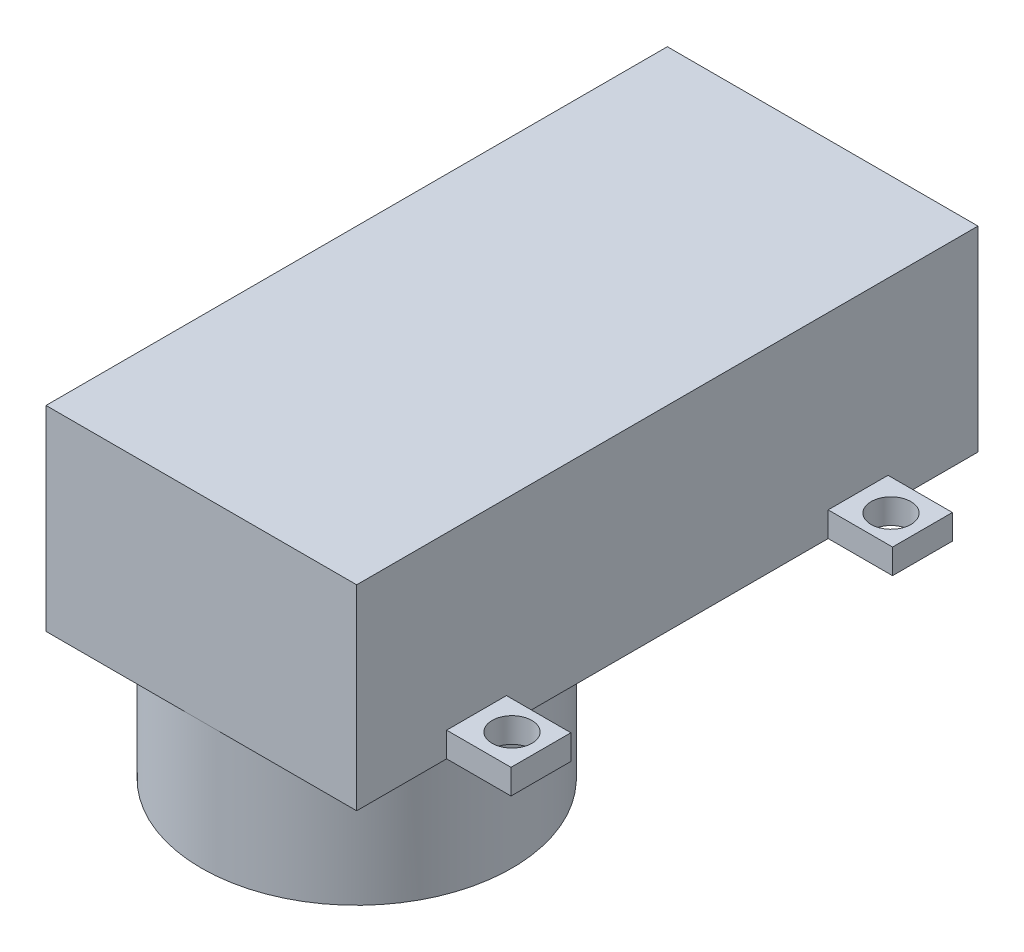
ISO-10303-21;
HEADER;
FILE_DESCRIPTION(('STEP AP214'),'2;1');
FILE_NAME('part.step','',(''),(''),'','','');
FILE_SCHEMA(('AUTOMOTIVE_DESIGN { 1 0 10303 214 1 1 1 1 }'));
ENDSEC;
DATA;
#1=APPLICATION_CONTEXT('core data for automotive mechanical design processes');
#2=APPLICATION_PROTOCOL_DEFINITION('international standard','automotive_design',2000,#1);
#3=PRODUCT_CONTEXT('',#1,'mechanical');
#4=PRODUCT('Part','Part','',(#3));
#5=PRODUCT_RELATED_PRODUCT_CATEGORY('part','',(#4));
#6=PRODUCT_DEFINITION_FORMATION('','',#4);
#7=PRODUCT_DEFINITION_CONTEXT('part definition',#1,'design');
#8=PRODUCT_DEFINITION('design','',#6,#7);
#9=PRODUCT_DEFINITION_SHAPE('','',#8);
#10=(LENGTH_UNIT() NAMED_UNIT(*) SI_UNIT(.MILLI.,.METRE.));
#11=(NAMED_UNIT(*) PLANE_ANGLE_UNIT() SI_UNIT($,.RADIAN.));
#12=(NAMED_UNIT(*) SI_UNIT($,.STERADIAN.) SOLID_ANGLE_UNIT());
#13=UNCERTAINTY_MEASURE_WITH_UNIT(LENGTH_MEASURE(1.E-05),#10,'distance_accuracy_value','');
#14=(GEOMETRIC_REPRESENTATION_CONTEXT(3) GLOBAL_UNCERTAINTY_ASSIGNED_CONTEXT((#13)) GLOBAL_UNIT_ASSIGNED_CONTEXT((#10,
#11,#12)) REPRESENTATION_CONTEXT('',''));
#15=CARTESIAN_POINT('',(0.,0.,0.));
#16=DIRECTION('',(0.,0.,1.));
#17=DIRECTION('',(1.,0.,0.));
#18=AXIS2_PLACEMENT_3D('',#15,#16,#17);
#19=CARTESIAN_POINT('',(0.,0.,0.));
#20=DIRECTION('',(0.,1.,0.));
#21=DIRECTION('',(0.,0.,1.));
#22=AXIS2_PLACEMENT_3D('',#19,#20,#21);
#23=PLANE('',#22);
#24=CARTESIAN_POINT('',(0.,0.,12.5));
#25=DIRECTION('',(0.,-1.,0.));
#26=DIRECTION('',(0.,0.,-1.));
#27=AXIS2_PLACEMENT_3D('',#24,#25,#26);
#28=CIRCLE('',#27,12.5);
#29=CARTESIAN_POINT('',(12.5,0.,12.5));
#30=VERTEX_POINT('',#29);
#31=CARTESIAN_POINT('',(0.,0.,25.));
#32=VERTEX_POINT('',#31);
#33=EDGE_CURVE('E55',#30,#32,#28,.T.);
#34=ORIENTED_EDGE('',*,*,#33,.F.);
#35=DIRECTION('',(0.,0.,-1.));
#36=VECTOR('',#35,1.);
#37=CARTESIAN_POINT('',(12.5,0.,-12.9434523975906));
#38=LINE('',#37,#36);
#39=CARTESIAN_POINT('',(12.5,0.,12.9434523975906));
#40=VERTEX_POINT('',#39);
#41=EDGE_CURVE('E193',#40,#30,#38,.T.);
#42=ORIENTED_EDGE('',*,*,#41,.F.);
#43=DIRECTION('',(-1.,0.,0.));
#44=VECTOR('',#43,1.);
#45=CARTESIAN_POINT('',(12.5,0.,12.9434523975906));
#46=LINE('',#45,#44);
#47=CARTESIAN_POINT('',(17.6802067776789,0.,12.9434523975906));
#48=VERTEX_POINT('',#47);
#49=EDGE_CURVE('E212',#48,#40,#46,.T.);
#50=ORIENTED_EDGE('',*,*,#49,.F.);
#51=DIRECTION('',(0.,0.,-1.));
#52=VECTOR('',#51,1.);
#53=CARTESIAN_POINT('',(17.6802067776789,0.,17.760130656844));
#54=LINE('',#53,#52);
#55=CARTESIAN_POINT('',(17.6802067776789,0.,17.760130656844));
#56=VERTEX_POINT('',#55);
#57=EDGE_CURVE('E327',#56,#48,#54,.T.);
#58=ORIENTED_EDGE('',*,*,#57,.F.);
#59=DIRECTION('',(1.,0.,0.));
#60=VECTOR('',#59,1.);
#61=CARTESIAN_POINT('',(12.5,0.,17.760130656844));
#62=LINE('',#61,#60);
#63=CARTESIAN_POINT('',(12.5,0.,17.760130656844));
#64=VERTEX_POINT('',#63);
#65=EDGE_CURVE('E324',#64,#56,#62,.T.);
#66=ORIENTED_EDGE('',*,*,#65,.F.);
#67=DIRECTION('',(0.,0.,-1.));
#68=VECTOR('',#67,1.);
#69=CARTESIAN_POINT('',(12.5,0.,17.760130656844));
#70=LINE('',#69,#68);
#71=CARTESIAN_POINT('',(12.5,0.,25.));
#72=VERTEX_POINT('',#71);
#73=EDGE_CURVE('E279',#72,#64,#70,.T.);
#74=ORIENTED_EDGE('',*,*,#73,.F.);
#75=DIRECTION('',(1.,0.,0.));
#76=VECTOR('',#75,1.);
#77=CARTESIAN_POINT('',(-12.5,0.,25.));
#78=LINE('',#77,#76);
#79=EDGE_CURVE('E216',#32,#72,#78,.T.);
#80=ORIENTED_EDGE('',*,*,#79,.F.);
#81=EDGE_LOOP('',(#34,#42,#50,#58,#66,#74,#80));
#82=FACE_BOUND('',#81,.T.);
#83=CARTESIAN_POINT('',(15.25,0.,15.25));
#84=DIRECTION('',(0.,1.,0.));
#85=DIRECTION('',(0.,0.,-1.));
#86=AXIS2_PLACEMENT_3D('',#83,#84,#85);
#87=CIRCLE('',#86,1.6);
#88=CARTESIAN_POINT('',(15.25,0.,13.65));
#89=VERTEX_POINT('',#88);
#90=EDGE_CURVE('E255',#89,#89,#87,.T.);
#91=ORIENTED_EDGE('',*,*,#90,.T.);
#92=EDGE_LOOP('',(#91));
#93=FACE_BOUND('',#92,.T.);
#94=ADVANCED_FACE('F43',(#82,#93),#23,.F.);
#95=CARTESIAN_POINT('',(-12.5,0.,12.5));
#96=VERTEX_POINT('',#95);
#97=EDGE_CURVE('E11',#32,#96,#28,.T.);
#98=ORIENTED_EDGE('',*,*,#97,.F.);
#99=CARTESIAN_POINT('',(-12.5,0.,25.));
#100=VERTEX_POINT('',#99);
#101=EDGE_CURVE('E287',#100,#32,#78,.T.);
#102=ORIENTED_EDGE('',*,*,#101,.F.);
#103=DIRECTION('',(0.,0.,1.));
#104=VECTOR('',#103,1.);
#105=CARTESIAN_POINT('',(-12.5,0.,17.760130656844));
#106=LINE('',#105,#104);
#107=CARTESIAN_POINT('',(-12.5,0.,17.760130656844));
#108=VERTEX_POINT('',#107);
#109=EDGE_CURVE('E372',#108,#100,#106,.T.);
#110=ORIENTED_EDGE('',*,*,#109,.F.);
#111=DIRECTION('',(1.,0.,0.));
#112=VECTOR('',#111,1.);
#113=CARTESIAN_POINT('',(-12.5,0.,17.760130656844));
#114=LINE('',#113,#112);
#115=CARTESIAN_POINT('',(-17.6802067776789,0.,17.760130656844));
#116=VERTEX_POINT('',#115);
#117=EDGE_CURVE('E369',#116,#108,#114,.T.);
#118=ORIENTED_EDGE('',*,*,#117,.F.);
#119=DIRECTION('',(0.,0.,1.));
#120=VECTOR('',#119,1.);
#121=CARTESIAN_POINT('',(-17.6802067776789,0.,17.760130656844));
#122=LINE('',#121,#120);
#123=CARTESIAN_POINT('',(-17.6802067776789,0.,12.9434523975906));
#124=VERTEX_POINT('',#123);
#125=EDGE_CURVE('E366',#124,#116,#122,.T.);
#126=ORIENTED_EDGE('',*,*,#125,.F.);
#127=DIRECTION('',(-1.,0.,0.));
#128=VECTOR('',#127,1.);
#129=CARTESIAN_POINT('',(-12.5,0.,12.9434523975906));
#130=LINE('',#129,#128);
#131=CARTESIAN_POINT('',(-12.5,0.,12.9434523975906));
#132=VERTEX_POINT('',#131);
#133=EDGE_CURVE('E363',#132,#124,#130,.T.);
#134=ORIENTED_EDGE('',*,*,#133,.F.);
#135=DIRECTION('',(0.,0.,1.));
#136=VECTOR('',#135,1.);
#137=CARTESIAN_POINT('',(-12.5,0.,-12.9434523975906));
#138=LINE('',#137,#136);
#139=EDGE_CURVE('E358',#96,#132,#138,.T.);
#140=ORIENTED_EDGE('',*,*,#139,.F.);
#141=EDGE_LOOP('',(#98,#102,#110,#118,#126,#134,#140));
#142=FACE_BOUND('',#141,.T.);
#143=CARTESIAN_POINT('',(-15.25,0.,15.25));
#144=DIRECTION('',(0.,1.,0.));
#145=DIRECTION('',(0.,0.,1.));
#146=AXIS2_PLACEMENT_3D('',#143,#144,#145);
#147=CIRCLE('',#146,1.6);
#148=CARTESIAN_POINT('',(-15.25,0.,16.85));
#149=VERTEX_POINT('',#148);
#150=EDGE_CURVE('E244',#149,#149,#147,.T.);
#151=ORIENTED_EDGE('',*,*,#150,.T.);
#152=EDGE_LOOP('',(#151));
#153=FACE_BOUND('',#152,.T.);
#154=ADVANCED_FACE('F475',(#142,#153),#23,.F.);
#155=CARTESIAN_POINT('',(0.,2.,0.));
#156=DIRECTION('',(0.,1.,0.));
#157=DIRECTION('',(0.,0.,1.));
#158=AXIS2_PLACEMENT_3D('',#155,#156,#157);
#159=PLANE('',#158);
#160=DIRECTION('',(0.,0.,-1.));
#161=VECTOR('',#160,1.);
#162=CARTESIAN_POINT('',(12.5,2.,-25.));
#163=LINE('',#162,#161);
#164=CARTESIAN_POINT('',(12.5,2.,17.760130656844));
#165=VERTEX_POINT('',#164);
#166=CARTESIAN_POINT('',(12.5,2.,12.9434523975906));
#167=VERTEX_POINT('',#166);
#168=EDGE_CURVE('E223',#165,#167,#163,.T.);
#169=ORIENTED_EDGE('',*,*,#168,.F.);
#170=DIRECTION('',(1.,0.,0.));
#171=VECTOR('',#170,1.);
#172=CARTESIAN_POINT('',(12.5,2.,17.760130656844));
#173=LINE('',#172,#171);
#174=CARTESIAN_POINT('',(17.6802067776789,2.,17.760130656844));
#175=VERTEX_POINT('',#174);
#176=EDGE_CURVE('E283',#165,#175,#173,.T.);
#177=ORIENTED_EDGE('',*,*,#176,.T.);
#178=DIRECTION('',(0.,0.,-1.));
#179=VECTOR('',#178,1.);
#180=CARTESIAN_POINT('',(17.6802067776789,2.,17.760130656844));
#181=LINE('',#180,#179);
#182=CARTESIAN_POINT('',(17.6802067776789,2.,12.9434523975906));
#183=VERTEX_POINT('',#182);
#184=EDGE_CURVE('E286',#175,#183,#181,.T.);
#185=ORIENTED_EDGE('',*,*,#184,.T.);
#186=DIRECTION('',(-1.,0.,0.));
#187=VECTOR('',#186,1.);
#188=CARTESIAN_POINT('',(12.5,2.,12.9434523975906));
#189=LINE('',#188,#187);
#190=EDGE_CURVE('E290',#183,#167,#189,.T.);
#191=ORIENTED_EDGE('',*,*,#190,.T.);
#192=EDGE_LOOP('',(#169,#177,#185,#191));
#193=FACE_BOUND('',#192,.T.);
#194=CARTESIAN_POINT('',(15.25,2.,15.25));
#195=DIRECTION('',(0.,1.,0.));
#196=DIRECTION('',(0.,0.,-1.));
#197=AXIS2_PLACEMENT_3D('',#194,#195,#196);
#198=CIRCLE('',#197,1.6);
#199=CARTESIAN_POINT('',(15.25,2.,13.65));
#200=VERTEX_POINT('',#199);
#201=EDGE_CURVE('E259',#200,#200,#198,.T.);
#202=ORIENTED_EDGE('',*,*,#201,.F.);
#203=EDGE_LOOP('',(#202));
#204=FACE_BOUND('',#203,.T.);
#205=ADVANCED_FACE('F526',(#193,#204),#159,.T.);
#206=CARTESIAN_POINT('',(12.5,2.,-12.9434523975906));
#207=VERTEX_POINT('',#206);
#208=CARTESIAN_POINT('',(12.5,2.,-17.760130656844));
#209=VERTEX_POINT('',#208);
#210=EDGE_CURVE('E225',#207,#209,#163,.T.);
#211=ORIENTED_EDGE('',*,*,#210,.F.);
#212=DIRECTION('',(1.,0.,0.));
#213=VECTOR('',#212,1.);
#214=CARTESIAN_POINT('',(12.5,2.,-12.9434523975906));
#215=LINE('',#214,#213);
#216=CARTESIAN_POINT('',(17.6802067776789,2.,-12.9434523975906));
#217=VERTEX_POINT('',#216);
#218=EDGE_CURVE('E293',#207,#217,#215,.T.);
#219=ORIENTED_EDGE('',*,*,#218,.T.);
#220=DIRECTION('',(0.,0.,-1.));
#221=VECTOR('',#220,1.);
#222=CARTESIAN_POINT('',(17.6802067776789,2.,-17.760130656844));
#223=LINE('',#222,#221);
#224=CARTESIAN_POINT('',(17.6802067776789,2.,-17.760130656844));
#225=VERTEX_POINT('',#224);
#226=EDGE_CURVE('E296',#217,#225,#223,.T.);
#227=ORIENTED_EDGE('',*,*,#226,.T.);
#228=DIRECTION('',(-1.,0.,0.));
#229=VECTOR('',#228,1.);
#230=CARTESIAN_POINT('',(12.5,2.,-17.760130656844));
#231=LINE('',#230,#229);
#232=EDGE_CURVE('E299',#225,#209,#231,.T.);
#233=ORIENTED_EDGE('',*,*,#232,.T.);
#234=EDGE_LOOP('',(#211,#219,#227,#233));
#235=FACE_BOUND('',#234,.T.);
#236=CARTESIAN_POINT('',(15.25,2.,-15.25));
#237=DIRECTION('',(0.,1.,0.));
#238=DIRECTION('',(0.,0.,1.));
#239=AXIS2_PLACEMENT_3D('',#236,#237,#238);
#240=CIRCLE('',#239,1.6);
#241=CARTESIAN_POINT('',(15.25,2.,-13.65));
#242=VERTEX_POINT('',#241);
#243=EDGE_CURVE('E275',#242,#242,#240,.T.);
#244=ORIENTED_EDGE('',*,*,#243,.F.);
#245=EDGE_LOOP('',(#244));
#246=FACE_BOUND('',#245,.T.);
#247=ADVANCED_FACE('F538',(#235,#246),#159,.T.);
#248=DIRECTION('',(0.,0.,1.));
#249=VECTOR('',#248,1.);
#250=CARTESIAN_POINT('',(-12.5,2.,-25.));
#251=LINE('',#250,#249);
#252=CARTESIAN_POINT('',(-12.5,2.,-17.760130656844));
#253=VERTEX_POINT('',#252);
#254=CARTESIAN_POINT('',(-12.5,2.,-12.9434523975906));
#255=VERTEX_POINT('',#254);
#256=EDGE_CURVE('E246',#253,#255,#251,.T.);
#257=ORIENTED_EDGE('',*,*,#256,.F.);
#258=DIRECTION('',(-1.,0.,0.));
#259=VECTOR('',#258,1.);
#260=CARTESIAN_POINT('',(-12.5,2.,-17.760130656844));
#261=LINE('',#260,#259);
#262=CARTESIAN_POINT('',(-17.6802067776789,2.,-17.760130656844));
#263=VERTEX_POINT('',#262);
#264=EDGE_CURVE('E302',#253,#263,#261,.T.);
#265=ORIENTED_EDGE('',*,*,#264,.T.);
#266=DIRECTION('',(0.,0.,1.));
#267=VECTOR('',#266,1.);
#268=CARTESIAN_POINT('',(-17.6802067776789,2.,-17.760130656844));
#269=LINE('',#268,#267);
#270=CARTESIAN_POINT('',(-17.6802067776789,2.,-12.9434523975906));
#271=VERTEX_POINT('',#270);
#272=EDGE_CURVE('E305',#263,#271,#269,.T.);
#273=ORIENTED_EDGE('',*,*,#272,.T.);
#274=DIRECTION('',(1.,0.,0.));
#275=VECTOR('',#274,1.);
#276=CARTESIAN_POINT('',(-12.5,2.,-12.9434523975906));
#277=LINE('',#276,#275);
#278=EDGE_CURVE('E308',#271,#255,#277,.T.);
#279=ORIENTED_EDGE('',*,*,#278,.T.);
#280=EDGE_LOOP('',(#257,#265,#273,#279));
#281=FACE_BOUND('',#280,.T.);
#282=CARTESIAN_POINT('',(-15.25,2.,-15.25));
#283=DIRECTION('',(0.,1.,0.));
#284=DIRECTION('',(0.,0.,-1.));
#285=AXIS2_PLACEMENT_3D('',#282,#283,#284);
#286=CIRCLE('',#285,1.6);
#287=CARTESIAN_POINT('',(-15.25,2.,-16.85));
#288=VERTEX_POINT('',#287);
#289=EDGE_CURVE('E267',#288,#288,#286,.T.);
#290=ORIENTED_EDGE('',*,*,#289,.F.);
#291=EDGE_LOOP('',(#290));
#292=FACE_BOUND('',#291,.T.);
#293=ADVANCED_FACE('F505',(#281,#292),#159,.T.);
#294=CARTESIAN_POINT('',(-12.5,2.,12.9434523975906));
#295=VERTEX_POINT('',#294);
#296=CARTESIAN_POINT('',(-12.5,2.,17.760130656844));
#297=VERTEX_POINT('',#296);
#298=EDGE_CURVE('E250',#295,#297,#251,.T.);
#299=ORIENTED_EDGE('',*,*,#298,.F.);
#300=DIRECTION('',(-1.,0.,0.));
#301=VECTOR('',#300,1.);
#302=CARTESIAN_POINT('',(-12.5,2.,12.9434523975906));
#303=LINE('',#302,#301);
#304=CARTESIAN_POINT('',(-17.6802067776789,2.,12.9434523975906));
#305=VERTEX_POINT('',#304);
#306=EDGE_CURVE('E311',#295,#305,#303,.T.);
#307=ORIENTED_EDGE('',*,*,#306,.T.);
#308=DIRECTION('',(0.,0.,1.));
#309=VECTOR('',#308,1.);
#310=CARTESIAN_POINT('',(-17.6802067776789,2.,17.760130656844));
#311=LINE('',#310,#309);
#312=CARTESIAN_POINT('',(-17.6802067776789,2.,17.760130656844));
#313=VERTEX_POINT('',#312);
#314=EDGE_CURVE('E314',#305,#313,#311,.T.);
#315=ORIENTED_EDGE('',*,*,#314,.T.);
#316=DIRECTION('',(1.,0.,0.));
#317=VECTOR('',#316,1.);
#318=CARTESIAN_POINT('',(-12.5,2.,17.760130656844));
#319=LINE('',#318,#317);
#320=EDGE_CURVE('E317',#313,#297,#319,.T.);
#321=ORIENTED_EDGE('',*,*,#320,.T.);
#322=EDGE_LOOP('',(#299,#307,#315,#321));
#323=FACE_BOUND('',#322,.T.);
#324=CARTESIAN_POINT('',(-15.25,2.,15.25));
#325=DIRECTION('',(0.,1.,0.));
#326=DIRECTION('',(0.,0.,1.));
#327=AXIS2_PLACEMENT_3D('',#324,#325,#326);
#328=CIRCLE('',#327,1.6);
#329=CARTESIAN_POINT('',(-15.25,2.,16.85));
#330=VERTEX_POINT('',#329);
#331=EDGE_CURVE('E251',#330,#330,#328,.T.);
#332=ORIENTED_EDGE('',*,*,#331,.F.);
#333=EDGE_LOOP('',(#332));
#334=FACE_BOUND('',#333,.T.);
#335=ADVANCED_FACE('F465',(#323,#334),#159,.T.);
#336=EDGE_CURVE('E53',#96,#30,#28,.T.);
#337=ORIENTED_EDGE('',*,*,#336,.F.);
#338=CARTESIAN_POINT('',(-12.5,0.,-12.9434523975906));
#339=VERTEX_POINT('',#338);
#340=EDGE_CURVE('E359',#339,#96,#138,.T.);
#341=ORIENTED_EDGE('',*,*,#340,.F.);
#342=DIRECTION('',(1.,0.,0.));
#343=VECTOR('',#342,1.);
#344=CARTESIAN_POINT('',(-12.5,0.,-12.9434523975906));
#345=LINE('',#344,#343);
#346=CARTESIAN_POINT('',(-17.6802067776789,0.,-12.9434523975906));
#347=VERTEX_POINT('',#346);
#348=EDGE_CURVE('E355',#347,#339,#345,.T.);
#349=ORIENTED_EDGE('',*,*,#348,.F.);
#350=DIRECTION('',(0.,0.,1.));
#351=VECTOR('',#350,1.);
#352=CARTESIAN_POINT('',(-17.6802067776789,0.,-17.760130656844));
#353=LINE('',#352,#351);
#354=CARTESIAN_POINT('',(-17.6802067776789,0.,-17.760130656844));
#355=VERTEX_POINT('',#354);
#356=EDGE_CURVE('E352',#355,#347,#353,.T.);
#357=ORIENTED_EDGE('',*,*,#356,.F.);
#358=DIRECTION('',(-1.,0.,0.));
#359=VECTOR('',#358,1.);
#360=CARTESIAN_POINT('',(-12.5,0.,-17.760130656844));
#361=LINE('',#360,#359);
#362=CARTESIAN_POINT('',(-12.5,0.,-17.760130656844));
#363=VERTEX_POINT('',#362);
#364=EDGE_CURVE('E349',#363,#355,#361,.T.);
#365=ORIENTED_EDGE('',*,*,#364,.F.);
#366=DIRECTION('',(0.,0.,1.));
#367=VECTOR('',#366,1.);
#368=CARTESIAN_POINT('',(-12.5,0.,-25.));
#369=LINE('',#368,#367);
#370=CARTESIAN_POINT('',(-12.5,0.,-25.));
#371=VERTEX_POINT('',#370);
#372=EDGE_CURVE('E346',#371,#363,#369,.T.);
#373=ORIENTED_EDGE('',*,*,#372,.F.);
#374=DIRECTION('',(-1.,0.,0.));
#375=VECTOR('',#374,1.);
#376=CARTESIAN_POINT('',(-12.5,0.,-25.));
#377=LINE('',#376,#375);
#378=CARTESIAN_POINT('',(12.5,0.,-25.));
#379=VERTEX_POINT('',#378);
#380=EDGE_CURVE('E343',#379,#371,#377,.T.);
#381=ORIENTED_EDGE('',*,*,#380,.F.);
#382=DIRECTION('',(0.,0.,-1.));
#383=VECTOR('',#382,1.);
#384=CARTESIAN_POINT('',(12.5,0.,-25.));
#385=LINE('',#384,#383);
#386=CARTESIAN_POINT('',(12.5,0.,-17.760130656844));
#387=VERTEX_POINT('',#386);
#388=EDGE_CURVE('E340',#387,#379,#385,.T.);
#389=ORIENTED_EDGE('',*,*,#388,.F.);
#390=DIRECTION('',(-1.,0.,0.));
#391=VECTOR('',#390,1.);
#392=CARTESIAN_POINT('',(12.5,0.,-17.760130656844));
#393=LINE('',#392,#391);
#394=CARTESIAN_POINT('',(17.6802067776789,0.,-17.760130656844));
#395=VERTEX_POINT('',#394);
#396=EDGE_CURVE('E337',#395,#387,#393,.T.);
#397=ORIENTED_EDGE('',*,*,#396,.F.);
#398=DIRECTION('',(0.,0.,-1.));
#399=VECTOR('',#398,1.);
#400=CARTESIAN_POINT('',(17.6802067776789,0.,-17.760130656844));
#401=LINE('',#400,#399);
#402=CARTESIAN_POINT('',(17.6802067776789,0.,-12.9434523975906));
#403=VERTEX_POINT('',#402);
#404=EDGE_CURVE('E334',#403,#395,#401,.T.);
#405=ORIENTED_EDGE('',*,*,#404,.F.);
#406=DIRECTION('',(1.,0.,0.));
#407=VECTOR('',#406,1.);
#408=CARTESIAN_POINT('',(12.5,0.,-12.9434523975906));
#409=LINE('',#408,#407);
#410=CARTESIAN_POINT('',(12.5,0.,-12.9434523975906));
#411=VERTEX_POINT('',#410);
#412=EDGE_CURVE('E205',#411,#403,#409,.T.);
#413=ORIENTED_EDGE('',*,*,#412,.F.);
#414=EDGE_CURVE('E196',#30,#411,#38,.T.);
#415=ORIENTED_EDGE('',*,*,#414,.F.);
#416=EDGE_LOOP('',(#337,#341,#349,#357,#365,#373,#381,#389,#397,#405,#413,#415));
#417=FACE_BOUND('',#416,.T.);
#418=CARTESIAN_POINT('',(15.25,0.,-15.25));
#419=DIRECTION('',(0.,1.,0.));
#420=DIRECTION('',(0.,0.,1.));
#421=AXIS2_PLACEMENT_3D('',#418,#419,#420);
#422=CIRCLE('',#421,1.6);
#423=CARTESIAN_POINT('',(15.25,0.,-13.65));
#424=VERTEX_POINT('',#423);
#425=EDGE_CURVE('E271',#424,#424,#422,.T.);
#426=ORIENTED_EDGE('',*,*,#425,.T.);
#427=EDGE_LOOP('',(#426));
#428=FACE_BOUND('',#427,.T.);
#429=CARTESIAN_POINT('',(-15.25,0.,-15.25));
#430=DIRECTION('',(0.,1.,0.));
#431=DIRECTION('',(0.,0.,-1.));
#432=AXIS2_PLACEMENT_3D('',#429,#430,#431);
#433=CIRCLE('',#432,1.6);
#434=CARTESIAN_POINT('',(-15.25,0.,-16.85));
#435=VERTEX_POINT('',#434);
#436=EDGE_CURVE('E263',#435,#435,#433,.T.);
#437=ORIENTED_EDGE('',*,*,#436,.T.);
#438=EDGE_LOOP('',(#437));
#439=FACE_BOUND('',#438,.T.);
#440=ADVANCED_FACE('F208',(#417,#428,#439),#23,.F.);
#441=CARTESIAN_POINT('',(12.5,2.,17.760130656844));
#442=DIRECTION('',(0.,0.,-1.));
#443=DIRECTION('',(-1.,0.,0.));
#444=AXIS2_PLACEMENT_3D('',#441,#442,#443);
#445=PLANE('',#444);
#446=ORIENTED_EDGE('',*,*,#65,.T.);
#447=DIRECTION('',(0.,-1.,0.));
#448=VECTOR('',#447,1.);
#449=CARTESIAN_POINT('',(17.6802067776789,2.,17.760130656844));
#450=LINE('',#449,#448);
#451=EDGE_CURVE('E444',#175,#56,#450,.T.);
#452=ORIENTED_EDGE('',*,*,#451,.F.);
#453=ORIENTED_EDGE('',*,*,#176,.F.);
#454=DIRECTION('',(0.,-1.,0.));
#455=VECTOR('',#454,1.);
#456=CARTESIAN_POINT('',(12.5,2.,17.760130656844));
#457=LINE('',#456,#455);
#458=EDGE_CURVE('E47',#165,#64,#457,.T.);
#459=ORIENTED_EDGE('',*,*,#458,.T.);
#460=EDGE_LOOP('',(#446,#452,#453,#459));
#461=FACE_BOUND('',#460,.T.);
#462=ADVANCED_FACE('F45',(#461),#445,.F.);
#463=CARTESIAN_POINT('',(17.6802067776789,2.,17.760130656844));
#464=DIRECTION('',(-1.,0.,0.));
#465=DIRECTION('',(0.,0.,1.));
#466=AXIS2_PLACEMENT_3D('',#463,#464,#465);
#467=PLANE('',#466);
#468=ORIENTED_EDGE('',*,*,#57,.T.);
#469=DIRECTION('',(0.,-1.,0.));
#470=VECTOR('',#469,1.);
#471=CARTESIAN_POINT('',(17.6802067776789,2.,12.9434523975906));
#472=LINE('',#471,#470);
#473=EDGE_CURVE('E441',#183,#48,#472,.T.);
#474=ORIENTED_EDGE('',*,*,#473,.F.);
#475=ORIENTED_EDGE('',*,*,#184,.F.);
#476=ORIENTED_EDGE('',*,*,#451,.T.);
#477=EDGE_LOOP('',(#468,#474,#475,#476));
#478=FACE_BOUND('',#477,.T.);
#479=ADVANCED_FACE('F534',(#478),#467,.F.);
#480=CARTESIAN_POINT('',(12.5,2.,12.9434523975906));
#481=DIRECTION('',(0.,0.,1.));
#482=DIRECTION('',(1.,0.,0.));
#483=AXIS2_PLACEMENT_3D('',#480,#481,#482);
#484=PLANE('',#483);
#485=ORIENTED_EDGE('',*,*,#49,.T.);
#486=DIRECTION('',(0.,-1.,0.));
#487=VECTOR('',#486,1.);
#488=CARTESIAN_POINT('',(12.5,2.,12.9434523975906));
#489=LINE('',#488,#487);
#490=EDGE_CURVE('E200',#167,#40,#489,.T.);
#491=ORIENTED_EDGE('',*,*,#490,.F.);
#492=ORIENTED_EDGE('',*,*,#190,.F.);
#493=ORIENTED_EDGE('',*,*,#473,.T.);
#494=EDGE_LOOP('',(#485,#491,#492,#493));
#495=FACE_BOUND('',#494,.T.);
#496=ADVANCED_FACE('F652',(#495),#484,.F.);
#497=CARTESIAN_POINT('',(12.5,2.,-12.9434523975906));
#498=DIRECTION('',(0.,0.,-1.));
#499=DIRECTION('',(-1.,0.,0.));
#500=AXIS2_PLACEMENT_3D('',#497,#498,#499);
#501=PLANE('',#500);
#502=ORIENTED_EDGE('',*,*,#412,.T.);
#503=DIRECTION('',(0.,-1.,0.));
#504=VECTOR('',#503,1.);
#505=CARTESIAN_POINT('',(17.6802067776789,2.,-12.9434523975906));
#506=LINE('',#505,#504);
#507=EDGE_CURVE('E432',#217,#403,#506,.T.);
#508=ORIENTED_EDGE('',*,*,#507,.F.);
#509=ORIENTED_EDGE('',*,*,#218,.F.);
#510=DIRECTION('',(0.,-1.,0.));
#511=VECTOR('',#510,1.);
#512=CARTESIAN_POINT('',(12.5,2.,-12.9434523975906));
#513=LINE('',#512,#511);
#514=EDGE_CURVE('E436',#207,#411,#513,.T.);
#515=ORIENTED_EDGE('',*,*,#514,.T.);
#516=EDGE_LOOP('',(#502,#508,#509,#515));
#517=FACE_BOUND('',#516,.T.);
#518=ADVANCED_FACE('F657',(#517),#501,.F.);
#519=CARTESIAN_POINT('',(17.6802067776789,2.,-17.760130656844));
#520=DIRECTION('',(-1.,0.,0.));
#521=DIRECTION('',(0.,0.,1.));
#522=AXIS2_PLACEMENT_3D('',#519,#520,#521);
#523=PLANE('',#522);
#524=ORIENTED_EDGE('',*,*,#404,.T.);
#525=DIRECTION('',(0.,-1.,0.));
#526=VECTOR('',#525,1.);
#527=CARTESIAN_POINT('',(17.6802067776789,2.,-17.760130656844));
#528=LINE('',#527,#526);
#529=EDGE_CURVE('E428',#225,#395,#528,.T.);
#530=ORIENTED_EDGE('',*,*,#529,.F.);
#531=ORIENTED_EDGE('',*,*,#226,.F.);
#532=ORIENTED_EDGE('',*,*,#507,.T.);
#533=EDGE_LOOP('',(#524,#530,#531,#532));
#534=FACE_BOUND('',#533,.T.);
#535=ADVANCED_FACE('F668',(#534),#523,.F.);
#536=CARTESIAN_POINT('',(12.5,2.,-17.760130656844));
#537=DIRECTION('',(0.,0.,1.));
#538=DIRECTION('',(1.,0.,0.));
#539=AXIS2_PLACEMENT_3D('',#536,#537,#538);
#540=PLANE('',#539);
#541=ORIENTED_EDGE('',*,*,#396,.T.);
#542=DIRECTION('',(0.,-1.,0.));
#543=VECTOR('',#542,1.);
#544=CARTESIAN_POINT('',(12.5,2.,-17.760130656844));
#545=LINE('',#544,#543);
#546=EDGE_CURVE('E424',#209,#387,#545,.T.);
#547=ORIENTED_EDGE('',*,*,#546,.F.);
#548=ORIENTED_EDGE('',*,*,#232,.F.);
#549=ORIENTED_EDGE('',*,*,#529,.T.);
#550=EDGE_LOOP('',(#541,#547,#548,#549));
#551=FACE_BOUND('',#550,.T.);
#552=ADVANCED_FACE('F677',(#551),#540,.F.);
#553=CARTESIAN_POINT('',(12.5,2.,-25.));
#554=DIRECTION('',(-1.,0.,0.));
#555=DIRECTION('',(0.,0.,1.));
#556=AXIS2_PLACEMENT_3D('',#553,#554,#555);
#557=PLANE('',#556);
#558=ORIENTED_EDGE('',*,*,#388,.T.);
#559=DIRECTION('',(0.,-1.,0.));
#560=VECTOR('',#559,1.);
#561=CARTESIAN_POINT('',(12.5,2.,-25.));
#562=LINE('',#561,#560);
#563=CARTESIAN_POINT('',(12.5,15.75,-25.));
#564=VERTEX_POINT('',#563);
#565=EDGE_CURVE('E420',#564,#379,#562,.T.);
#566=ORIENTED_EDGE('',*,*,#565,.F.);
#567=DIRECTION('',(0.,0.,-1.));
#568=VECTOR('',#567,1.);
#569=CARTESIAN_POINT('',(12.5,15.75,-25.));
#570=LINE('',#569,#568);
#571=CARTESIAN_POINT('',(12.5,15.75,25.));
#572=VERTEX_POINT('',#571);
#573=EDGE_CURVE('E229',#572,#564,#570,.T.);
#574=ORIENTED_EDGE('',*,*,#573,.F.);
#575=DIRECTION('',(0.,-1.,0.));
#576=VECTOR('',#575,1.);
#577=CARTESIAN_POINT('',(12.5,2.,25.));
#578=LINE('',#577,#576);
#579=EDGE_CURVE('E320',#572,#72,#578,.T.);
#580=ORIENTED_EDGE('',*,*,#579,.T.);
#581=ORIENTED_EDGE('',*,*,#73,.T.);
#582=ORIENTED_EDGE('',*,*,#458,.F.);
#583=ORIENTED_EDGE('',*,*,#168,.T.);
#584=ORIENTED_EDGE('',*,*,#490,.T.);
#585=ORIENTED_EDGE('',*,*,#41,.T.);
#586=ORIENTED_EDGE('',*,*,#414,.T.);
#587=ORIENTED_EDGE('',*,*,#514,.F.);
#588=ORIENTED_EDGE('',*,*,#210,.T.);
#589=ORIENTED_EDGE('',*,*,#546,.T.);
#590=EDGE_LOOP('',(#558,#566,#574,#580,#581,#582,#583,#584,#585,#586,#587,#588,#589));
#591=FACE_BOUND('',#590,.T.);
#592=ADVANCED_FACE('F194',(#591),#557,.F.);
#593=CARTESIAN_POINT('',(-12.5,2.,-25.));
#594=DIRECTION('',(0.,0.,1.));
#595=DIRECTION('',(1.,0.,0.));
#596=AXIS2_PLACEMENT_3D('',#593,#594,#595);
#597=PLANE('',#596);
#598=ORIENTED_EDGE('',*,*,#380,.T.);
#599=DIRECTION('',(0.,-1.,0.));
#600=VECTOR('',#599,1.);
#601=CARTESIAN_POINT('',(-12.5,2.,-25.));
#602=LINE('',#601,#600);
#603=CARTESIAN_POINT('',(-12.5,15.75,-25.));
#604=VERTEX_POINT('',#603);
#605=EDGE_CURVE('E416',#604,#371,#602,.T.);
#606=ORIENTED_EDGE('',*,*,#605,.F.);
#607=DIRECTION('',(-1.,0.,0.));
#608=VECTOR('',#607,1.);
#609=CARTESIAN_POINT('',(-12.5,15.75,-25.));
#610=LINE('',#609,#608);
#611=EDGE_CURVE('E233',#564,#604,#610,.T.);
#612=ORIENTED_EDGE('',*,*,#611,.F.);
#613=ORIENTED_EDGE('',*,*,#565,.T.);
#614=EDGE_LOOP('',(#598,#606,#612,#613));
#615=FACE_BOUND('',#614,.T.);
#616=ADVANCED_FACE('F489',(#615),#597,.F.);
#617=CARTESIAN_POINT('',(-12.5,2.,-17.760130656844));
#618=DIRECTION('',(0.,0.,1.));
#619=DIRECTION('',(1.,0.,0.));
#620=AXIS2_PLACEMENT_3D('',#617,#618,#619);
#621=PLANE('',#620);
#622=ORIENTED_EDGE('',*,*,#364,.T.);
#623=DIRECTION('',(0.,-1.,0.));
#624=VECTOR('',#623,1.);
#625=CARTESIAN_POINT('',(-17.6802067776789,2.,-17.760130656844));
#626=LINE('',#625,#624);
#627=EDGE_CURVE('E408',#263,#355,#626,.T.);
#628=ORIENTED_EDGE('',*,*,#627,.F.);
#629=ORIENTED_EDGE('',*,*,#264,.F.);
#630=DIRECTION('',(0.,-1.,0.));
#631=VECTOR('',#630,1.);
#632=CARTESIAN_POINT('',(-12.5,2.,-17.760130656844));
#633=LINE('',#632,#631);
#634=EDGE_CURVE('E412',#253,#363,#633,.T.);
#635=ORIENTED_EDGE('',*,*,#634,.T.);
#636=EDGE_LOOP('',(#622,#628,#629,#635));
#637=FACE_BOUND('',#636,.T.);
#638=ADVANCED_FACE('F497',(#637),#621,.F.);
#639=CARTESIAN_POINT('',(-17.6802067776789,2.,-17.760130656844));
#640=DIRECTION('',(1.,0.,0.));
#641=DIRECTION('',(0.,0.,-1.));
#642=AXIS2_PLACEMENT_3D('',#639,#640,#641);
#643=PLANE('',#642);
#644=ORIENTED_EDGE('',*,*,#356,.T.);
#645=DIRECTION('',(0.,-1.,0.));
#646=VECTOR('',#645,1.);
#647=CARTESIAN_POINT('',(-17.6802067776789,2.,-12.9434523975906));
#648=LINE('',#647,#646);
#649=EDGE_CURVE('E404',#271,#347,#648,.T.);
#650=ORIENTED_EDGE('',*,*,#649,.F.);
#651=ORIENTED_EDGE('',*,*,#272,.F.);
#652=ORIENTED_EDGE('',*,*,#627,.T.);
#653=EDGE_LOOP('',(#644,#650,#651,#652));
#654=FACE_BOUND('',#653,.T.);
#655=ADVANCED_FACE('F501',(#654),#643,.F.);
#656=CARTESIAN_POINT('',(-12.5,2.,-12.9434523975906));
#657=DIRECTION('',(0.,0.,-1.));
#658=DIRECTION('',(-1.,0.,0.));
#659=AXIS2_PLACEMENT_3D('',#656,#657,#658);
#660=PLANE('',#659);
#661=ORIENTED_EDGE('',*,*,#348,.T.);
#662=DIRECTION('',(0.,-1.,0.));
#663=VECTOR('',#662,1.);
#664=CARTESIAN_POINT('',(-12.5,2.,-12.9434523975906));
#665=LINE('',#664,#663);
#666=EDGE_CURVE('E400',#255,#339,#665,.T.);
#667=ORIENTED_EDGE('',*,*,#666,.F.);
#668=ORIENTED_EDGE('',*,*,#278,.F.);
#669=ORIENTED_EDGE('',*,*,#649,.T.);
#670=EDGE_LOOP('',(#661,#667,#668,#669));
#671=FACE_BOUND('',#670,.T.);
#672=ADVANCED_FACE('F509',(#671),#660,.F.);
#673=CARTESIAN_POINT('',(-12.5,2.,12.9434523975906));
#674=DIRECTION('',(0.,0.,1.));
#675=DIRECTION('',(1.,0.,0.));
#676=AXIS2_PLACEMENT_3D('',#673,#674,#675);
#677=PLANE('',#676);
#678=ORIENTED_EDGE('',*,*,#133,.T.);
#679=DIRECTION('',(0.,-1.,0.));
#680=VECTOR('',#679,1.);
#681=CARTESIAN_POINT('',(-17.6802067776789,2.,12.9434523975906));
#682=LINE('',#681,#680);
#683=EDGE_CURVE('E392',#305,#124,#682,.T.);
#684=ORIENTED_EDGE('',*,*,#683,.F.);
#685=ORIENTED_EDGE('',*,*,#306,.F.);
#686=DIRECTION('',(0.,-1.,0.));
#687=VECTOR('',#686,1.);
#688=CARTESIAN_POINT('',(-12.5,2.,12.9434523975906));
#689=LINE('',#688,#687);
#690=EDGE_CURVE('E396',#295,#132,#689,.T.);
#691=ORIENTED_EDGE('',*,*,#690,.T.);
#692=EDGE_LOOP('',(#678,#684,#685,#691));
#693=FACE_BOUND('',#692,.T.);
#694=ADVANCED_FACE('F511',(#693),#677,.F.);
#695=CARTESIAN_POINT('',(-17.6802067776789,2.,17.760130656844));
#696=DIRECTION('',(1.,0.,0.));
#697=DIRECTION('',(0.,0.,-1.));
#698=AXIS2_PLACEMENT_3D('',#695,#696,#697);
#699=PLANE('',#698);
#700=ORIENTED_EDGE('',*,*,#125,.T.);
#701=DIRECTION('',(0.,-1.,0.));
#702=VECTOR('',#701,1.);
#703=CARTESIAN_POINT('',(-17.6802067776789,2.,17.760130656844));
#704=LINE('',#703,#702);
#705=EDGE_CURVE('E388',#313,#116,#704,.T.);
#706=ORIENTED_EDGE('',*,*,#705,.F.);
#707=ORIENTED_EDGE('',*,*,#314,.F.);
#708=ORIENTED_EDGE('',*,*,#683,.T.);
#709=EDGE_LOOP('',(#700,#706,#707,#708));
#710=FACE_BOUND('',#709,.T.);
#711=ADVANCED_FACE('F517',(#710),#699,.F.);
#712=CARTESIAN_POINT('',(-12.5,2.,17.760130656844));
#713=DIRECTION('',(0.,0.,-1.));
#714=DIRECTION('',(-1.,0.,0.));
#715=AXIS2_PLACEMENT_3D('',#712,#713,#714);
#716=PLANE('',#715);
#717=ORIENTED_EDGE('',*,*,#117,.T.);
#718=DIRECTION('',(0.,-1.,0.));
#719=VECTOR('',#718,1.);
#720=CARTESIAN_POINT('',(-12.5,2.,17.760130656844));
#721=LINE('',#720,#719);
#722=EDGE_CURVE('E384',#297,#108,#721,.T.);
#723=ORIENTED_EDGE('',*,*,#722,.F.);
#724=ORIENTED_EDGE('',*,*,#320,.F.);
#725=ORIENTED_EDGE('',*,*,#705,.T.);
#726=EDGE_LOOP('',(#717,#723,#724,#725));
#727=FACE_BOUND('',#726,.T.);
#728=ADVANCED_FACE('F472',(#727),#716,.F.);
#729=CARTESIAN_POINT('',(-12.5,2.,17.760130656844));
#730=DIRECTION('',(1.,0.,0.));
#731=DIRECTION('',(0.,0.,-1.));
#732=AXIS2_PLACEMENT_3D('',#729,#730,#731);
#733=PLANE('',#732);
#734=ORIENTED_EDGE('',*,*,#109,.T.);
#735=DIRECTION('',(0.,-1.,0.));
#736=VECTOR('',#735,1.);
#737=CARTESIAN_POINT('',(-12.5,2.,25.));
#738=LINE('',#737,#736);
#739=CARTESIAN_POINT('',(-12.5,15.75,25.));
#740=VERTEX_POINT('',#739);
#741=EDGE_CURVE('E380',#740,#100,#738,.T.);
#742=ORIENTED_EDGE('',*,*,#741,.F.);
#743=DIRECTION('',(0.,0.,1.));
#744=VECTOR('',#743,1.);
#745=CARTESIAN_POINT('',(-12.5,15.75,-25.));
#746=LINE('',#745,#744);
#747=EDGE_CURVE('E237',#604,#740,#746,.T.);
#748=ORIENTED_EDGE('',*,*,#747,.F.);
#749=ORIENTED_EDGE('',*,*,#605,.T.);
#750=ORIENTED_EDGE('',*,*,#372,.T.);
#751=ORIENTED_EDGE('',*,*,#634,.F.);
#752=ORIENTED_EDGE('',*,*,#256,.T.);
#753=ORIENTED_EDGE('',*,*,#666,.T.);
#754=ORIENTED_EDGE('',*,*,#340,.T.);
#755=ORIENTED_EDGE('',*,*,#139,.T.);
#756=ORIENTED_EDGE('',*,*,#690,.F.);
#757=ORIENTED_EDGE('',*,*,#298,.T.);
#758=ORIENTED_EDGE('',*,*,#722,.T.);
#759=EDGE_LOOP('',(#734,#742,#748,#749,#750,#751,#752,#753,#754,#755,#756,#757,#758));
#760=FACE_BOUND('',#759,.T.);
#761=ADVANCED_FACE('F460',(#760),#733,.F.);
#762=CARTESIAN_POINT('',(-12.5,2.,25.));
#763=DIRECTION('',(0.,0.,-1.));
#764=DIRECTION('',(-1.,0.,0.));
#765=AXIS2_PLACEMENT_3D('',#762,#763,#764);
#766=PLANE('',#765);
#767=ORIENTED_EDGE('',*,*,#101,.T.);
#768=ORIENTED_EDGE('',*,*,#79,.T.);
#769=ORIENTED_EDGE('',*,*,#579,.F.);
#770=DIRECTION('',(1.,0.,0.));
#771=VECTOR('',#770,1.);
#772=CARTESIAN_POINT('',(-12.5,15.75,25.));
#773=LINE('',#772,#771);
#774=EDGE_CURVE('E241',#740,#572,#773,.T.);
#775=ORIENTED_EDGE('',*,*,#774,.F.);
#776=ORIENTED_EDGE('',*,*,#741,.T.);
#777=EDGE_LOOP('',(#767,#768,#769,#775,#776));
#778=FACE_BOUND('',#777,.T.);
#779=ADVANCED_FACE('F481',(#778),#766,.F.);
#780=CARTESIAN_POINT('',(15.25,2.,-15.25));
#781=DIRECTION('',(0.,-1.,0.));
#782=DIRECTION('',(0.,0.,-1.));
#783=AXIS2_PLACEMENT_3D('',#780,#781,#782);
#784=CYLINDRICAL_SURFACE('',#783,1.6);
#785=ORIENTED_EDGE('',*,*,#243,.T.);
#786=EDGE_LOOP('',(#785));
#787=FACE_BOUND('',#786,.T.);
#788=ORIENTED_EDGE('',*,*,#425,.F.);
#789=EDGE_LOOP('',(#788));
#790=FACE_BOUND('',#789,.T.);
#791=ADVANCED_FACE('F562',(#787,#790),#784,.F.);
#792=CARTESIAN_POINT('',(-15.25,2.,-15.25));
#793=DIRECTION('',(0.,-1.,0.));
#794=DIRECTION('',(0.,0.,-1.));
#795=AXIS2_PLACEMENT_3D('',#792,#793,#794);
#796=CYLINDRICAL_SURFACE('',#795,1.6);
#797=ORIENTED_EDGE('',*,*,#289,.T.);
#798=EDGE_LOOP('',(#797));
#799=FACE_BOUND('',#798,.T.);
#800=ORIENTED_EDGE('',*,*,#436,.F.);
#801=EDGE_LOOP('',(#800));
#802=FACE_BOUND('',#801,.T.);
#803=ADVANCED_FACE('F553',(#799,#802),#796,.F.);
#804=CARTESIAN_POINT('',(15.25,2.,15.25));
#805=DIRECTION('',(0.,-1.,0.));
#806=DIRECTION('',(0.,0.,-1.));
#807=AXIS2_PLACEMENT_3D('',#804,#805,#806);
#808=CYLINDRICAL_SURFACE('',#807,1.6);
#809=ORIENTED_EDGE('',*,*,#201,.T.);
#810=EDGE_LOOP('',(#809));
#811=FACE_BOUND('',#810,.T.);
#812=ORIENTED_EDGE('',*,*,#90,.F.);
#813=EDGE_LOOP('',(#812));
#814=FACE_BOUND('',#813,.T.);
#815=ADVANCED_FACE('F549',(#811,#814),#808,.F.);
#816=CARTESIAN_POINT('',(-15.25,2.,15.25));
#817=DIRECTION('',(0.,-1.,0.));
#818=DIRECTION('',(0.,0.,-1.));
#819=AXIS2_PLACEMENT_3D('',#816,#817,#818);
#820=CYLINDRICAL_SURFACE('',#819,1.6);
#821=ORIENTED_EDGE('',*,*,#331,.T.);
#822=EDGE_LOOP('',(#821));
#823=FACE_BOUND('',#822,.T.);
#824=ORIENTED_EDGE('',*,*,#150,.F.);
#825=EDGE_LOOP('',(#824));
#826=FACE_BOUND('',#825,.T.);
#827=ADVANCED_FACE('F552',(#823,#826),#820,.F.);
#828=CARTESIAN_POINT('',(0.,15.75,0.));
#829=DIRECTION('',(0.,1.,0.));
#830=DIRECTION('',(0.,0.,1.));
#831=AXIS2_PLACEMENT_3D('',#828,#829,#830);
#832=PLANE('',#831);
#833=ORIENTED_EDGE('',*,*,#573,.T.);
#834=ORIENTED_EDGE('',*,*,#611,.T.);
#835=ORIENTED_EDGE('',*,*,#747,.T.);
#836=ORIENTED_EDGE('',*,*,#774,.T.);
#837=EDGE_LOOP('',(#833,#834,#835,#836));
#838=FACE_BOUND('',#837,.T.);
#839=ADVANCED_FACE('F484',(#838),#832,.T.);
#840=CARTESIAN_POINT('',(0.,-10.25,12.5));
#841=DIRECTION('',(0.,1.,0.));
#842=DIRECTION('',(0.,0.,1.));
#843=AXIS2_PLACEMENT_3D('',#840,#841,#842);
#844=CYLINDRICAL_SURFACE('',#843,12.5);
#845=CARTESIAN_POINT('',(0.,-10.25,12.5));
#846=DIRECTION('',(0.,-1.,0.));
#847=DIRECTION('',(0.,0.,-1.));
#848=AXIS2_PLACEMENT_3D('',#845,#846,#847);
#849=CIRCLE('',#848,12.5);
#850=CARTESIAN_POINT('',(0.,-10.25,0.));
#851=VERTEX_POINT('',#850);
#852=EDGE_CURVE('E220',#851,#851,#849,.T.);
#853=ORIENTED_EDGE('',*,*,#852,.F.);
#854=EDGE_LOOP('',(#853));
#855=FACE_BOUND('',#854,.T.);
#856=ORIENTED_EDGE('',*,*,#33,.T.);
#857=ORIENTED_EDGE('',*,*,#97,.T.);
#858=ORIENTED_EDGE('',*,*,#336,.T.);
#859=EDGE_LOOP('',(#856,#857,#858));
#860=FACE_BOUND('',#859,.T.);
#861=ADVANCED_FACE('F221',(#855,#860),#844,.T.);
#862=CARTESIAN_POINT('',(0.,-10.25,12.5));
#863=DIRECTION('',(0.,-1.,0.));
#864=DIRECTION('',(0.,0.,-1.));
#865=AXIS2_PLACEMENT_3D('',#862,#863,#864);
#866=PLANE('',#865);
#867=ORIENTED_EDGE('',*,*,#852,.T.);
#868=EDGE_LOOP('',(#867));
#869=FACE_BOUND('',#868,.T.);
#870=ADVANCED_FACE('F594',(#869),#866,.T.);
#871=CLOSED_SHELL('',(#94,#154,#205,#247,#293,#335,#440,#462,#479,#496,#518,#535,#552,#592,#616,
#638,#655,#672,#694,#711,#728,#761,#779,#791,#803,#815,#827,#839,#861,#870));
#872=MANIFOLD_SOLID_BREP('B2',#871);
#873=ADVANCED_BREP_SHAPE_REPRESENTATION('',(#18,#872),#14);
#874=SHAPE_DEFINITION_REPRESENTATION(#9,#873);
ENDSEC;
END-ISO-10303-21;
